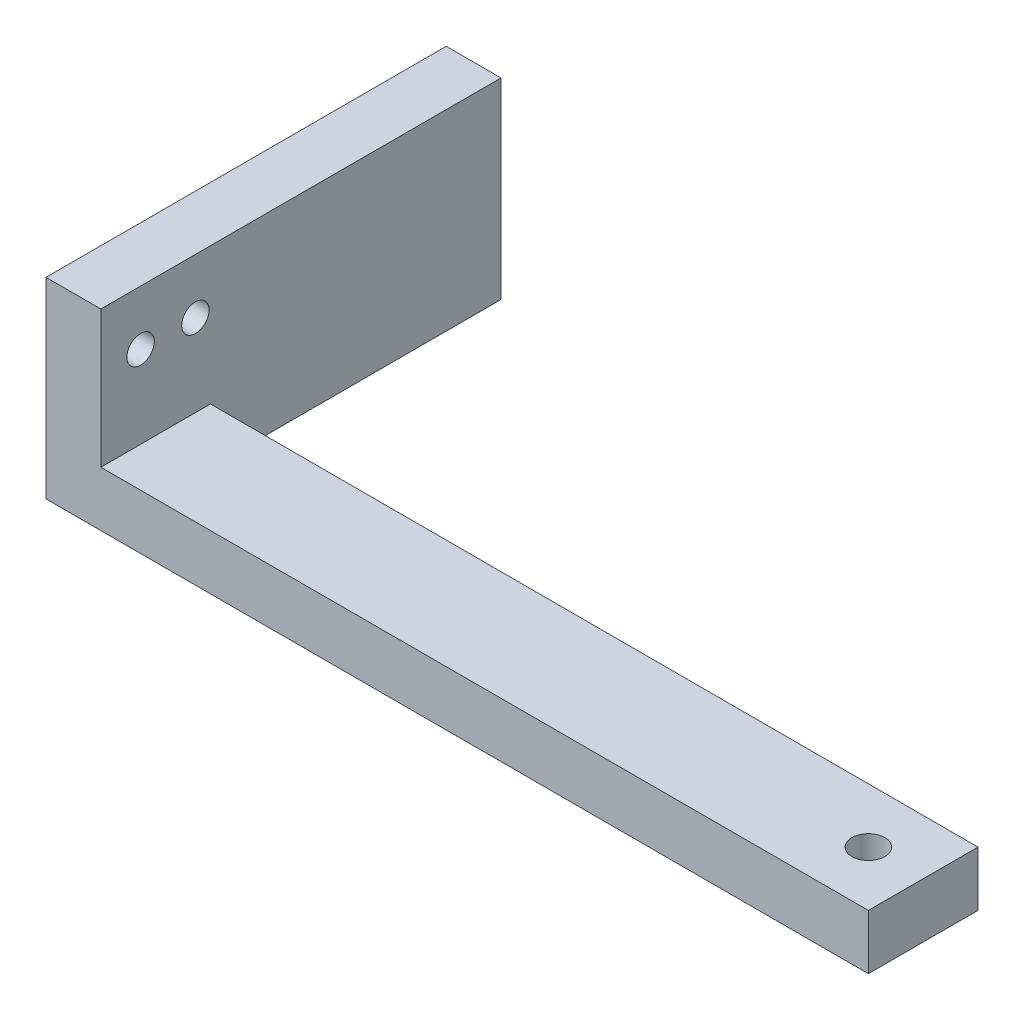
ISO-10303-21;
HEADER;
FILE_DESCRIPTION(('STEP AP214'),'2;1');
FILE_NAME('part.step','',(''),(''),'','','');
FILE_SCHEMA(('AUTOMOTIVE_DESIGN { 1 0 10303 214 1 1 1 1 }'));
ENDSEC;
DATA;
#1=APPLICATION_CONTEXT('core data for automotive mechanical design processes');
#2=APPLICATION_PROTOCOL_DEFINITION('international standard','automotive_design',2000,#1);
#3=PRODUCT_CONTEXT('',#1,'mechanical');
#4=PRODUCT('Part','Part','',(#3));
#5=PRODUCT_RELATED_PRODUCT_CATEGORY('part','',(#4));
#6=PRODUCT_DEFINITION_FORMATION('','',#4);
#7=PRODUCT_DEFINITION_CONTEXT('part definition',#1,'design');
#8=PRODUCT_DEFINITION('design','',#6,#7);
#9=PRODUCT_DEFINITION_SHAPE('','',#8);
#10=(LENGTH_UNIT() NAMED_UNIT(*) SI_UNIT(.MILLI.,.METRE.));
#11=(NAMED_UNIT(*) PLANE_ANGLE_UNIT() SI_UNIT($,.RADIAN.));
#12=(NAMED_UNIT(*) SI_UNIT($,.STERADIAN.) SOLID_ANGLE_UNIT());
#13=UNCERTAINTY_MEASURE_WITH_UNIT(LENGTH_MEASURE(1.E-05),#10,'distance_accuracy_value','');
#14=(GEOMETRIC_REPRESENTATION_CONTEXT(3) GLOBAL_UNCERTAINTY_ASSIGNED_CONTEXT((#13)) GLOBAL_UNIT_ASSIGNED_CONTEXT((#10,
#11,#12)) REPRESENTATION_CONTEXT('',''));
#15=CARTESIAN_POINT('',(0.,0.,0.));
#16=DIRECTION('',(0.,0.,1.));
#17=DIRECTION('',(1.,0.,0.));
#18=AXIS2_PLACEMENT_3D('',#15,#16,#17);
#19=CARTESIAN_POINT('',(0.,10.,0.));
#20=DIRECTION('',(0.,1.,0.));
#21=DIRECTION('',(0.,0.,1.));
#22=AXIS2_PLACEMENT_3D('',#19,#20,#21);
#23=PLANE('',#22);
#24=CARTESIAN_POINT('',(-2407.77070063694,10.,-441.167728237792));
#25=DIRECTION('',(0.,1.,0.));
#26=DIRECTION('',(0.,0.,1.));
#27=AXIS2_PLACEMENT_3D('',#24,#25,#26);
#28=CIRCLE('',#27,3.00000000000017);
#29=CARTESIAN_POINT('',(-2407.77070063694,10.,-438.167728237792));
#30=VERTEX_POINT('',#29);
#31=EDGE_CURVE('E132',#30,#30,#28,.T.);
#32=ORIENTED_EDGE('',*,*,#31,.F.);
#33=EDGE_LOOP('',(#32));
#34=FACE_BOUND('',#33,.T.);
#35=DIRECTION('',(-1.,0.,0.));
#36=VECTOR('',#35,1.);
#37=CARTESIAN_POINT('',(-2547.77070063694,10.,-451.167728237792));
#38=LINE('',#37,#36);
#39=CARTESIAN_POINT('',(-2397.77070063694,10.,-451.167728237792));
#40=VERTEX_POINT('',#39);
#41=CARTESIAN_POINT('',(-2537.77070063694,10.,-451.167728237793));
#42=VERTEX_POINT('',#41);
#43=EDGE_CURVE('E90',#40,#42,#38,.T.);
#44=ORIENTED_EDGE('',*,*,#43,.T.);
#45=DIRECTION('',(0.,0.,1.));
#46=VECTOR('',#45,1.);
#47=CARTESIAN_POINT('',(-2537.77070063694,10.,-454.167728237792));
#48=LINE('',#47,#46);
#49=CARTESIAN_POINT('',(-2537.77070063694,10.,-431.167728237792));
#50=VERTEX_POINT('',#49);
#51=EDGE_CURVE('E11',#42,#50,#48,.T.);
#52=ORIENTED_EDGE('',*,*,#51,.T.);
#53=DIRECTION('',(1.,0.,0.));
#54=VECTOR('',#53,1.);
#55=CARTESIAN_POINT('',(-2547.77070063694,10.,-431.167728237792));
#56=LINE('',#55,#54);
#57=CARTESIAN_POINT('',(-2397.77070063694,10.,-431.167728237792));
#58=VERTEX_POINT('',#57);
#59=EDGE_CURVE('E99',#50,#58,#56,.T.);
#60=ORIENTED_EDGE('',*,*,#59,.T.);
#61=DIRECTION('',(0.,0.,-1.));
#62=VECTOR('',#61,1.);
#63=CARTESIAN_POINT('',(-2397.77070063694,10.,-451.167728237792));
#64=LINE('',#63,#62);
#65=EDGE_CURVE('E57',#58,#40,#64,.T.);
#66=ORIENTED_EDGE('',*,*,#65,.T.);
#67=EDGE_LOOP('',(#44,#52,#60,#66));
#68=FACE_BOUND('',#67,.T.);
#69=ADVANCED_FACE('F32',(#34,#68),#23,.T.);
#70=CARTESIAN_POINT('',(-2547.77070063694,10.,-451.167728237792));
#71=DIRECTION('',(1.,0.,0.));
#72=DIRECTION('',(0.,0.,-1.));
#73=AXIS2_PLACEMENT_3D('',#70,#71,#72);
#74=PLANE('',#73);
#75=CARTESIAN_POINT('',(-2547.77070063694,25.,-448.417728237792));
#76=DIRECTION('',(-1.,0.,0.));
#77=DIRECTION('',(0.,0.,1.));
#78=AXIS2_PLACEMENT_3D('',#75,#76,#77);
#79=CIRCLE('',#78,2.50000000000002);
#80=CARTESIAN_POINT('',(-2547.77070063694,25.,-445.917728237792));
#81=VERTEX_POINT('',#80);
#82=EDGE_CURVE('E108',#81,#81,#79,.T.);
#83=ORIENTED_EDGE('',*,*,#82,.F.);
#84=EDGE_LOOP('',(#83));
#85=FACE_BOUND('',#84,.T.);
#86=CARTESIAN_POINT('',(-2547.77070063694,25.,-438.417728237792));
#87=DIRECTION('',(-1.,0.,0.));
#88=DIRECTION('',(0.,0.,1.));
#89=AXIS2_PLACEMENT_3D('',#86,#87,#88);
#90=CIRCLE('',#89,2.50000000000002);
#91=CARTESIAN_POINT('',(-2547.77070063694,25.,-435.917728237792));
#92=VERTEX_POINT('',#91);
#93=EDGE_CURVE('E114',#92,#92,#90,.T.);
#94=ORIENTED_EDGE('',*,*,#93,.F.);
#95=EDGE_LOOP('',(#94));
#96=FACE_BOUND('',#95,.T.);
#97=DIRECTION('',(0.,0.,-1.));
#98=VECTOR('',#97,1.);
#99=CARTESIAN_POINT('',(-2547.77070063694,35.,-454.167728237792));
#100=LINE('',#99,#98);
#101=CARTESIAN_POINT('',(-2547.77070063694,35.,-431.167728237792));
#102=VERTEX_POINT('',#101);
#103=CARTESIAN_POINT('',(-2547.77070063694,35.,-504.167728237793));
#104=VERTEX_POINT('',#103);
#105=EDGE_CURVE('E112',#102,#104,#100,.T.);
#106=ORIENTED_EDGE('',*,*,#105,.T.);
#107=DIRECTION('',(0.,-1.,0.));
#108=VECTOR('',#107,1.);
#109=CARTESIAN_POINT('',(-2547.77070063694,35.,-504.167728237793));
#110=LINE('',#109,#108);
#111=CARTESIAN_POINT('',(-2547.77070063694,0.,-504.167728237793));
#112=VERTEX_POINT('',#111);
#113=EDGE_CURVE('E155',#104,#112,#110,.T.);
#114=ORIENTED_EDGE('',*,*,#113,.T.);
#115=DIRECTION('',(0.,0.,1.));
#116=VECTOR('',#115,1.);
#117=CARTESIAN_POINT('',(-2547.77070063694,0.,-451.167728237792));
#118=LINE('',#117,#116);
#119=CARTESIAN_POINT('',(-2547.77070063694,0.,-431.167728237792));
#120=VERTEX_POINT('',#119);
#121=EDGE_CURVE('E136',#112,#120,#118,.T.);
#122=ORIENTED_EDGE('',*,*,#121,.T.);
#123=DIRECTION('',(0.,-1.,0.));
#124=VECTOR('',#123,1.);
#125=CARTESIAN_POINT('',(-2547.77070063694,10.,-431.167728237792));
#126=LINE('',#125,#124);
#127=EDGE_CURVE('E41',#102,#120,#126,.T.);
#128=ORIENTED_EDGE('',*,*,#127,.F.);
#129=EDGE_LOOP('',(#106,#114,#122,#128));
#130=FACE_BOUND('',#129,.T.);
#131=ADVANCED_FACE('F34',(#85,#96,#130),#74,.F.);
#132=CARTESIAN_POINT('',(-2547.77070063694,10.,-431.167728237792));
#133=DIRECTION('',(0.,0.,-1.));
#134=DIRECTION('',(-1.,0.,0.));
#135=AXIS2_PLACEMENT_3D('',#132,#133,#134);
#136=PLANE('',#135);
#137=DIRECTION('',(1.,0.,0.));
#138=VECTOR('',#137,1.);
#139=CARTESIAN_POINT('',(-2547.77070063694,0.,-431.167728237792));
#140=LINE('',#139,#138);
#141=CARTESIAN_POINT('',(-2397.77070063694,0.,-431.167728237792));
#142=VERTEX_POINT('',#141);
#143=EDGE_CURVE('E83',#120,#142,#140,.T.);
#144=ORIENTED_EDGE('',*,*,#143,.T.);
#145=DIRECTION('',(0.,-1.,0.));
#146=VECTOR('',#145,1.);
#147=CARTESIAN_POINT('',(-2397.77070063694,10.,-431.167728237792));
#148=LINE('',#147,#146);
#149=EDGE_CURVE('E79',#58,#142,#148,.T.);
#150=ORIENTED_EDGE('',*,*,#149,.F.);
#151=ORIENTED_EDGE('',*,*,#59,.F.);
#152=DIRECTION('',(0.,1.,0.));
#153=VECTOR('',#152,1.);
#154=CARTESIAN_POINT('',(-2537.77070063694,35.,-431.167728237792));
#155=LINE('',#154,#153);
#156=CARTESIAN_POINT('',(-2537.77070063694,35.,-431.167728237792));
#157=VERTEX_POINT('',#156);
#158=EDGE_CURVE('E49',#50,#157,#155,.T.);
#159=ORIENTED_EDGE('',*,*,#158,.T.);
#160=DIRECTION('',(-1.,0.,0.));
#161=VECTOR('',#160,1.);
#162=CARTESIAN_POINT('',(-2537.77070063694,35.,-431.167728237792));
#163=LINE('',#162,#161);
#164=EDGE_CURVE('E126',#157,#102,#163,.T.);
#165=ORIENTED_EDGE('',*,*,#164,.T.);
#166=ORIENTED_EDGE('',*,*,#127,.T.);
#167=EDGE_LOOP('',(#144,#150,#151,#159,#165,#166));
#168=FACE_BOUND('',#167,.T.);
#169=ADVANCED_FACE('F143',(#168),#136,.F.);
#170=CARTESIAN_POINT('',(-2397.77070063694,10.,-451.167728237792));
#171=DIRECTION('',(-1.,0.,0.));
#172=DIRECTION('',(0.,0.,1.));
#173=AXIS2_PLACEMENT_3D('',#170,#171,#172);
#174=PLANE('',#173);
#175=DIRECTION('',(0.,0.,-1.));
#176=VECTOR('',#175,1.);
#177=CARTESIAN_POINT('',(-2397.77070063694,0.,-451.167728237792));
#178=LINE('',#177,#176);
#179=CARTESIAN_POINT('',(-2397.77070063694,0.,-451.167728237792));
#180=VERTEX_POINT('',#179);
#181=EDGE_CURVE('E73',#142,#180,#178,.T.);
#182=ORIENTED_EDGE('',*,*,#181,.T.);
#183=DIRECTION('',(0.,-1.,0.));
#184=VECTOR('',#183,1.);
#185=CARTESIAN_POINT('',(-2397.77070063694,10.,-451.167728237792));
#186=LINE('',#185,#184);
#187=EDGE_CURVE('E76',#40,#180,#186,.T.);
#188=ORIENTED_EDGE('',*,*,#187,.F.);
#189=ORIENTED_EDGE('',*,*,#65,.F.);
#190=ORIENTED_EDGE('',*,*,#149,.T.);
#191=EDGE_LOOP('',(#182,#188,#189,#190));
#192=FACE_BOUND('',#191,.T.);
#193=ADVANCED_FACE('F75',(#192),#174,.F.);
#194=CARTESIAN_POINT('',(-2547.77070063694,10.,-451.167728237792));
#195=DIRECTION('',(0.,0.,1.));
#196=DIRECTION('',(1.,0.,0.));
#197=AXIS2_PLACEMENT_3D('',#194,#195,#196);
#198=PLANE('',#197);
#199=DIRECTION('',(-1.,0.,0.));
#200=VECTOR('',#199,1.);
#201=CARTESIAN_POINT('',(-2547.77070063694,0.,-451.167728237792));
#202=LINE('',#201,#200);
#203=CARTESIAN_POINT('',(-2537.77070063694,0.,-451.167728237793));
#204=VERTEX_POINT('',#203);
#205=EDGE_CURVE('E82',#180,#204,#202,.T.);
#206=ORIENTED_EDGE('',*,*,#205,.T.);
#207=DIRECTION('',(0.,1.,0.));
#208=VECTOR('',#207,1.);
#209=CARTESIAN_POINT('',(-2537.77070063694,35.,-451.167728237793));
#210=LINE('',#209,#208);
#211=EDGE_CURVE('E168',#204,#42,#210,.T.);
#212=ORIENTED_EDGE('',*,*,#211,.T.);
#213=ORIENTED_EDGE('',*,*,#43,.F.);
#214=ORIENTED_EDGE('',*,*,#187,.T.);
#215=EDGE_LOOP('',(#206,#212,#213,#214));
#216=FACE_BOUND('',#215,.T.);
#217=ADVANCED_FACE('F87',(#216),#198,.F.);
#218=CARTESIAN_POINT('',(0.,0.,0.));
#219=DIRECTION('',(0.,1.,0.));
#220=DIRECTION('',(0.,0.,1.));
#221=AXIS2_PLACEMENT_3D('',#218,#219,#220);
#222=PLANE('',#221);
#223=CARTESIAN_POINT('',(-2407.77070063694,0.,-441.167728237792));
#224=DIRECTION('',(0.,1.,0.));
#225=DIRECTION('',(0.,0.,1.));
#226=AXIS2_PLACEMENT_3D('',#223,#224,#225);
#227=CIRCLE('',#226,3.00000000000017);
#228=CARTESIAN_POINT('',(-2407.77070063694,0.,-438.167728237792));
#229=VERTEX_POINT('',#228);
#230=EDGE_CURVE('E133',#229,#229,#227,.T.);
#231=ORIENTED_EDGE('',*,*,#230,.T.);
#232=EDGE_LOOP('',(#231));
#233=FACE_BOUND('',#232,.T.);
#234=ORIENTED_EDGE('',*,*,#121,.F.);
#235=DIRECTION('',(1.,0.,0.));
#236=VECTOR('',#235,1.);
#237=CARTESIAN_POINT('',(-2547.77070063694,0.,-504.167728237793));
#238=LINE('',#237,#236);
#239=CARTESIAN_POINT('',(-2537.77070063694,0.,-504.167728237793));
#240=VERTEX_POINT('',#239);
#241=EDGE_CURVE('E150',#112,#240,#238,.T.);
#242=ORIENTED_EDGE('',*,*,#241,.T.);
#243=DIRECTION('',(0.,0.,1.));
#244=VECTOR('',#243,1.);
#245=CARTESIAN_POINT('',(-2537.77070063694,0.,-504.167728237793));
#246=LINE('',#245,#244);
#247=EDGE_CURVE('E97',#240,#204,#246,.T.);
#248=ORIENTED_EDGE('',*,*,#247,.T.);
#249=ORIENTED_EDGE('',*,*,#205,.F.);
#250=ORIENTED_EDGE('',*,*,#181,.F.);
#251=ORIENTED_EDGE('',*,*,#143,.F.);
#252=EDGE_LOOP('',(#234,#242,#248,#249,#250,#251));
#253=FACE_BOUND('',#252,.T.);
#254=ADVANCED_FACE('F94',(#233,#253),#222,.F.);
#255=CARTESIAN_POINT('',(-2407.77070063694,0.,-441.167728237792));
#256=DIRECTION('',(0.,1.,0.));
#257=DIRECTION('',(0.,0.,1.));
#258=AXIS2_PLACEMENT_3D('',#255,#256,#257);
#259=CYLINDRICAL_SURFACE('',#258,3.00000000000017);
#260=ORIENTED_EDGE('',*,*,#230,.F.);
#261=EDGE_LOOP('',(#260));
#262=FACE_BOUND('',#261,.T.);
#263=ORIENTED_EDGE('',*,*,#31,.T.);
#264=EDGE_LOOP('',(#263));
#265=FACE_BOUND('',#264,.T.);
#266=ADVANCED_FACE('F209',(#262,#265),#259,.F.);
#267=CARTESIAN_POINT('',(-2537.77070063694,35.,-454.167728237792));
#268=DIRECTION('',(0.,1.,0.));
#269=DIRECTION('',(0.,0.,1.));
#270=AXIS2_PLACEMENT_3D('',#267,#268,#269);
#271=PLANE('',#270);
#272=DIRECTION('',(0.,0.,-1.));
#273=VECTOR('',#272,1.);
#274=CARTESIAN_POINT('',(-2537.77070063694,35.,-454.167728237792));
#275=LINE('',#274,#273);
#276=CARTESIAN_POINT('',(-2537.77070063694,35.,-504.167728237793));
#277=VERTEX_POINT('',#276);
#278=EDGE_CURVE('E124',#157,#277,#275,.T.);
#279=ORIENTED_EDGE('',*,*,#278,.T.);
#280=DIRECTION('',(-1.,0.,0.));
#281=VECTOR('',#280,1.);
#282=CARTESIAN_POINT('',(-2547.77070063694,35.,-504.167728237793));
#283=LINE('',#282,#281);
#284=EDGE_CURVE('E160',#277,#104,#283,.T.);
#285=ORIENTED_EDGE('',*,*,#284,.T.);
#286=ORIENTED_EDGE('',*,*,#105,.F.);
#287=ORIENTED_EDGE('',*,*,#164,.F.);
#288=EDGE_LOOP('',(#279,#285,#286,#287));
#289=FACE_BOUND('',#288,.T.);
#290=ADVANCED_FACE('F173',(#289),#271,.T.);
#291=CARTESIAN_POINT('',(-2537.77070063694,0.,0.));
#292=DIRECTION('',(-1.,0.,0.));
#293=DIRECTION('',(0.,0.,1.));
#294=AXIS2_PLACEMENT_3D('',#291,#292,#293);
#295=PLANE('',#294);
#296=ORIENTED_EDGE('',*,*,#51,.F.);
#297=ORIENTED_EDGE('',*,*,#211,.F.);
#298=ORIENTED_EDGE('',*,*,#247,.F.);
#299=DIRECTION('',(0.,1.,0.));
#300=VECTOR('',#299,1.);
#301=CARTESIAN_POINT('',(-2537.77070063694,35.,-504.167728237793));
#302=LINE('',#301,#300);
#303=EDGE_CURVE('E165',#240,#277,#302,.T.);
#304=ORIENTED_EDGE('',*,*,#303,.T.);
#305=ORIENTED_EDGE('',*,*,#278,.F.);
#306=ORIENTED_EDGE('',*,*,#158,.F.);
#307=EDGE_LOOP('',(#296,#297,#298,#304,#305,#306));
#308=FACE_BOUND('',#307,.T.);
#309=CARTESIAN_POINT('',(-2537.77070063694,25.,-448.417728237792));
#310=DIRECTION('',(-1.,0.,0.));
#311=DIRECTION('',(0.,0.,1.));
#312=AXIS2_PLACEMENT_3D('',#309,#310,#311);
#313=CIRCLE('',#312,2.50000000000002);
#314=CARTESIAN_POINT('',(-2537.77070063694,25.,-445.917728237792));
#315=VERTEX_POINT('',#314);
#316=EDGE_CURVE('E36',#315,#315,#313,.T.);
#317=ORIENTED_EDGE('',*,*,#316,.T.);
#318=EDGE_LOOP('',(#317));
#319=FACE_BOUND('',#318,.T.);
#320=CARTESIAN_POINT('',(-2537.77070063694,25.,-438.417728237792));
#321=DIRECTION('',(-1.,0.,0.));
#322=DIRECTION('',(0.,0.,1.));
#323=AXIS2_PLACEMENT_3D('',#320,#321,#322);
#324=CIRCLE('',#323,2.50000000000002);
#325=CARTESIAN_POINT('',(-2537.77070063694,25.,-435.917728237792));
#326=VERTEX_POINT('',#325);
#327=EDGE_CURVE('E106',#326,#326,#324,.T.);
#328=ORIENTED_EDGE('',*,*,#327,.T.);
#329=EDGE_LOOP('',(#328));
#330=FACE_BOUND('',#329,.T.);
#331=ADVANCED_FACE('F182',(#308,#319,#330),#295,.F.);
#332=CARTESIAN_POINT('',(-2397.77070063694,25.,-438.417728237792));
#333=DIRECTION('',(-1.,0.,0.));
#334=DIRECTION('',(0.,0.,1.));
#335=AXIS2_PLACEMENT_3D('',#332,#333,#334);
#336=CYLINDRICAL_SURFACE('',#335,2.50000000000002);
#337=ORIENTED_EDGE('',*,*,#93,.T.);
#338=EDGE_LOOP('',(#337));
#339=FACE_BOUND('',#338,.T.);
#340=ORIENTED_EDGE('',*,*,#327,.F.);
#341=EDGE_LOOP('',(#340));
#342=FACE_BOUND('',#341,.T.);
#343=ADVANCED_FACE('F185',(#339,#342),#336,.F.);
#344=CARTESIAN_POINT('',(-2397.77070063694,25.,-448.417728237792));
#345=DIRECTION('',(-1.,0.,0.));
#346=DIRECTION('',(0.,0.,1.));
#347=AXIS2_PLACEMENT_3D('',#344,#345,#346);
#348=CYLINDRICAL_SURFACE('',#347,2.50000000000002);
#349=ORIENTED_EDGE('',*,*,#82,.T.);
#350=EDGE_LOOP('',(#349));
#351=FACE_BOUND('',#350,.T.);
#352=ORIENTED_EDGE('',*,*,#316,.F.);
#353=EDGE_LOOP('',(#352));
#354=FACE_BOUND('',#353,.T.);
#355=ADVANCED_FACE('F189',(#351,#354),#348,.F.);
#356=CARTESIAN_POINT('',(0.,0.,-504.167728237793));
#357=DIRECTION('',(0.,0.,1.));
#358=DIRECTION('',(1.,0.,0.));
#359=AXIS2_PLACEMENT_3D('',#356,#357,#358);
#360=PLANE('',#359);
#361=ORIENTED_EDGE('',*,*,#303,.F.);
#362=ORIENTED_EDGE('',*,*,#241,.F.);
#363=ORIENTED_EDGE('',*,*,#113,.F.);
#364=ORIENTED_EDGE('',*,*,#284,.F.);
#365=EDGE_LOOP('',(#361,#362,#363,#364));
#366=FACE_BOUND('',#365,.T.);
#367=ADVANCED_FACE('F163',(#366),#360,.F.);
#368=CLOSED_SHELL('',(#69,#131,#169,#193,#217,#254,#266,#290,#331,#343,#355,#367));
#369=MANIFOLD_SOLID_BREP('B2',#368);
#370=ADVANCED_BREP_SHAPE_REPRESENTATION('',(#18,#369),#14);
#371=SHAPE_DEFINITION_REPRESENTATION(#9,#370);
ENDSEC;
END-ISO-10303-21;
